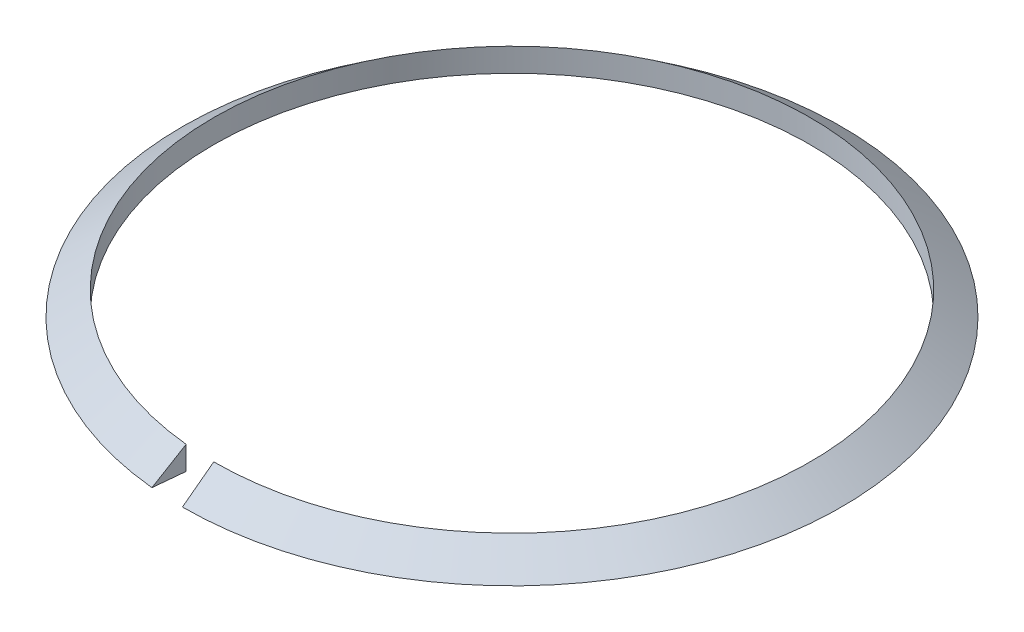
ISO-10303-21;
HEADER;
FILE_DESCRIPTION(('STEP AP214'),'2;1');
FILE_NAME('part.step','',(''),(''),'','','');
FILE_SCHEMA(('AUTOMOTIVE_DESIGN { 1 0 10303 214 1 1 1 1 }'));
ENDSEC;
DATA;
#1=APPLICATION_CONTEXT('core data for automotive mechanical design processes');
#2=APPLICATION_PROTOCOL_DEFINITION('international standard','automotive_design',2000,#1);
#3=PRODUCT_CONTEXT('',#1,'mechanical');
#4=PRODUCT('Part','Part','',(#3));
#5=PRODUCT_RELATED_PRODUCT_CATEGORY('part','',(#4));
#6=PRODUCT_DEFINITION_FORMATION('','',#4);
#7=PRODUCT_DEFINITION_CONTEXT('part definition',#1,'design');
#8=PRODUCT_DEFINITION('design','',#6,#7);
#9=PRODUCT_DEFINITION_SHAPE('','',#8);
#10=(LENGTH_UNIT() NAMED_UNIT(*) SI_UNIT(.MILLI.,.METRE.));
#11=(NAMED_UNIT(*) PLANE_ANGLE_UNIT() SI_UNIT($,.RADIAN.));
#12=(NAMED_UNIT(*) SI_UNIT($,.STERADIAN.) SOLID_ANGLE_UNIT());
#13=UNCERTAINTY_MEASURE_WITH_UNIT(LENGTH_MEASURE(1.E-05),#10,'distance_accuracy_value','');
#14=(GEOMETRIC_REPRESENTATION_CONTEXT(3) GLOBAL_UNCERTAINTY_ASSIGNED_CONTEXT((#13)) GLOBAL_UNIT_ASSIGNED_CONTEXT((#10,
#11,#12)) REPRESENTATION_CONTEXT('',''));
#15=CARTESIAN_POINT('',(0.,0.,0.));
#16=DIRECTION('',(0.,0.,1.));
#17=DIRECTION('',(1.,0.,0.));
#18=AXIS2_PLACEMENT_3D('',#15,#16,#17);
#19=CARTESIAN_POINT('',(0.,0.750569999999997,0.));
#20=DIRECTION('',(0.,-1.,0.));
#21=DIRECTION('',(0.,0.,-1.));
#22=AXIS2_PLACEMENT_3D('',#19,#20,#21);
#23=CONICAL_SURFACE('',#22,19.05,0.926685585888556);
#24=CARTESIAN_POINT('',(0.,0.750569999999997,0.));
#25=DIRECTION('',(0.,-1.,0.));
#26=DIRECTION('',(0.,0.,-1.));
#27=AXIS2_PLACEMENT_3D('',#24,#25,#26);
#28=CIRCLE('',#27,19.05);
#29=CARTESIAN_POINT('',(-1.85399070070998,0.750569999999997,18.9595679930129));
#30=VERTEX_POINT('',#29);
#31=CARTESIAN_POINT('',(0.,0.750569999999997,19.05));
#32=VERTEX_POINT('',#31);
#33=EDGE_CURVE('E11',#30,#32,#28,.T.);
#34=ORIENTED_EDGE('',*,*,#33,.T.);
#35=DIRECTION('',(0.,-0.600487594164845,0.799634072094303));
#36=VECTOR('',#35,1.);
#37=CARTESIAN_POINT('',(0.,-0.750570000000003,21.04898));
#38=LINE('',#37,#36);
#39=CARTESIAN_POINT('',(0.,-0.750570000000003,21.04898));
#40=VERTEX_POINT('',#39);
#41=EDGE_CURVE('E80',#32,#40,#38,.T.);
#42=ORIENTED_EDGE('',*,*,#41,.T.);
#43=CARTESIAN_POINT('',(0.,-0.750570000000003,0.));
#44=DIRECTION('',(0.,-1.,0.));
#45=DIRECTION('',(0.,0.,-1.));
#46=AXIS2_PLACEMENT_3D('',#43,#44,#45);
#47=CIRCLE('',#46,21.04898);
#48=CARTESIAN_POINT('',(-2.04853612490448,-0.750570000000003,20.9490586610798));
#49=VERTEX_POINT('',#48);
#50=EDGE_CURVE('E65',#49,#40,#47,.T.);
#51=ORIENTED_EDGE('',*,*,#50,.F.);
#52=DIRECTION('',(-0.0778222642327396,-0.600487594164845,0.795838139601141));
#53=VECTOR('',#52,1.);
#54=CARTESIAN_POINT('',(-2.04853612490448,-0.750570000000003,20.9490586610798));
#55=LINE('',#54,#53);
#56=EDGE_CURVE('E86',#30,#49,#55,.T.);
#57=ORIENTED_EDGE('',*,*,#56,.F.);
#58=EDGE_LOOP('',(#34,#42,#51,#57));
#59=FACE_BOUND('',#58,.T.);
#60=ADVANCED_FACE('F34',(#59),#23,.T.);
#61=CARTESIAN_POINT('',(0.,0.,0.));
#62=DIRECTION('',(0.,-1.,0.));
#63=DIRECTION('',(0.,0.,-1.));
#64=AXIS2_PLACEMENT_3D('',#61,#62,#63);
#65=CYLINDRICAL_SURFACE('',#64,19.05);
#66=CARTESIAN_POINT('',(0.,-0.750570000000003,0.));
#67=DIRECTION('',(0.,-1.,0.));
#68=DIRECTION('',(0.,0.,-1.));
#69=AXIS2_PLACEMENT_3D('',#66,#67,#68);
#70=CIRCLE('',#69,19.05);
#71=CARTESIAN_POINT('',(-1.85399070070998,-0.750570000000003,18.9595679930129));
#72=VERTEX_POINT('',#71);
#73=CARTESIAN_POINT('',(0.,-0.750570000000003,19.05));
#74=VERTEX_POINT('',#73);
#75=EDGE_CURVE('E42',#72,#74,#70,.T.);
#76=ORIENTED_EDGE('',*,*,#75,.T.);
#77=DIRECTION('',(0.,1.,0.));
#78=VECTOR('',#77,1.);
#79=CARTESIAN_POINT('',(0.,0.750569999999997,19.05));
#80=LINE('',#79,#78);
#81=EDGE_CURVE('E81',#74,#32,#80,.T.);
#82=ORIENTED_EDGE('',*,*,#81,.T.);
#83=ORIENTED_EDGE('',*,*,#33,.F.);
#84=DIRECTION('',(0.,1.,0.));
#85=VECTOR('',#84,1.);
#86=CARTESIAN_POINT('',(-1.85399070070998,0.750569999999997,18.9595679930129));
#87=LINE('',#86,#85);
#88=EDGE_CURVE('E75',#72,#30,#87,.T.);
#89=ORIENTED_EDGE('',*,*,#88,.F.);
#90=EDGE_LOOP('',(#76,#82,#83,#89));
#91=FACE_BOUND('',#90,.T.);
#92=ADVANCED_FACE('F36',(#91),#65,.F.);
#93=CARTESIAN_POINT('',(-1.85399070070998,-0.750570000000003,18.9595679930129));
#94=DIRECTION('',(0.,1.,0.));
#95=DIRECTION('',(0.,0.,1.));
#96=AXIS2_PLACEMENT_3D('',#93,#94,#95);
#97=PLANE('',#96);
#98=DIRECTION('',(0.0973223464939622,0.,-0.995252913019052));
#99=VECTOR('',#98,1.);
#100=CARTESIAN_POINT('',(-1.85399070070998,-0.750570000000003,18.9595679930129));
#101=LINE('',#100,#99);
#102=EDGE_CURVE('E70',#49,#72,#101,.T.);
#103=ORIENTED_EDGE('',*,*,#102,.F.);
#104=ORIENTED_EDGE('',*,*,#50,.T.);
#105=DIRECTION('',(0.,0.,-1.));
#106=VECTOR('',#105,1.);
#107=CARTESIAN_POINT('',(0.,-0.750570000000003,19.05));
#108=LINE('',#107,#106);
#109=EDGE_CURVE('E68',#40,#74,#108,.T.);
#110=ORIENTED_EDGE('',*,*,#109,.T.);
#111=ORIENTED_EDGE('',*,*,#75,.F.);
#112=EDGE_LOOP('',(#103,#104,#110,#111));
#113=FACE_BOUND('',#112,.T.);
#114=ADVANCED_FACE('F67',(#113),#97,.F.);
#115=CARTESIAN_POINT('',(-1.85399070070998,0.750569999999998,18.9595679930129));
#116=DIRECTION('',(-0.995252913019052,0.,-0.0973223464939622));
#117=DIRECTION('',(-0.0973223464939622,0.,0.995252913019052));
#118=AXIS2_PLACEMENT_3D('',#115,#116,#117);
#119=PLANE('',#118);
#120=ORIENTED_EDGE('',*,*,#56,.T.);
#121=ORIENTED_EDGE('',*,*,#102,.T.);
#122=ORIENTED_EDGE('',*,*,#88,.T.);
#123=EDGE_LOOP('',(#120,#121,#122));
#124=FACE_BOUND('',#123,.T.);
#125=ADVANCED_FACE('F90',(#124),#119,.F.);
#126=CARTESIAN_POINT('',(0.,0.750569999999998,19.05));
#127=DIRECTION('',(-1.,0.,0.));
#128=DIRECTION('',(0.,0.,1.));
#129=AXIS2_PLACEMENT_3D('',#126,#127,#128);
#130=PLANE('',#129);
#131=ORIENTED_EDGE('',*,*,#41,.F.);
#132=ORIENTED_EDGE('',*,*,#81,.F.);
#133=ORIENTED_EDGE('',*,*,#109,.F.);
#134=EDGE_LOOP('',(#131,#132,#133));
#135=FACE_BOUND('',#134,.T.);
#136=ADVANCED_FACE('F79',(#135),#130,.T.);
#137=CLOSED_SHELL('',(#60,#92,#114,#125,#136));
#138=MANIFOLD_SOLID_BREP('B2',#137);
#139=ADVANCED_BREP_SHAPE_REPRESENTATION('',(#18,#138),#14);
#140=SHAPE_DEFINITION_REPRESENTATION(#9,#139);
ENDSEC;
END-ISO-10303-21;
